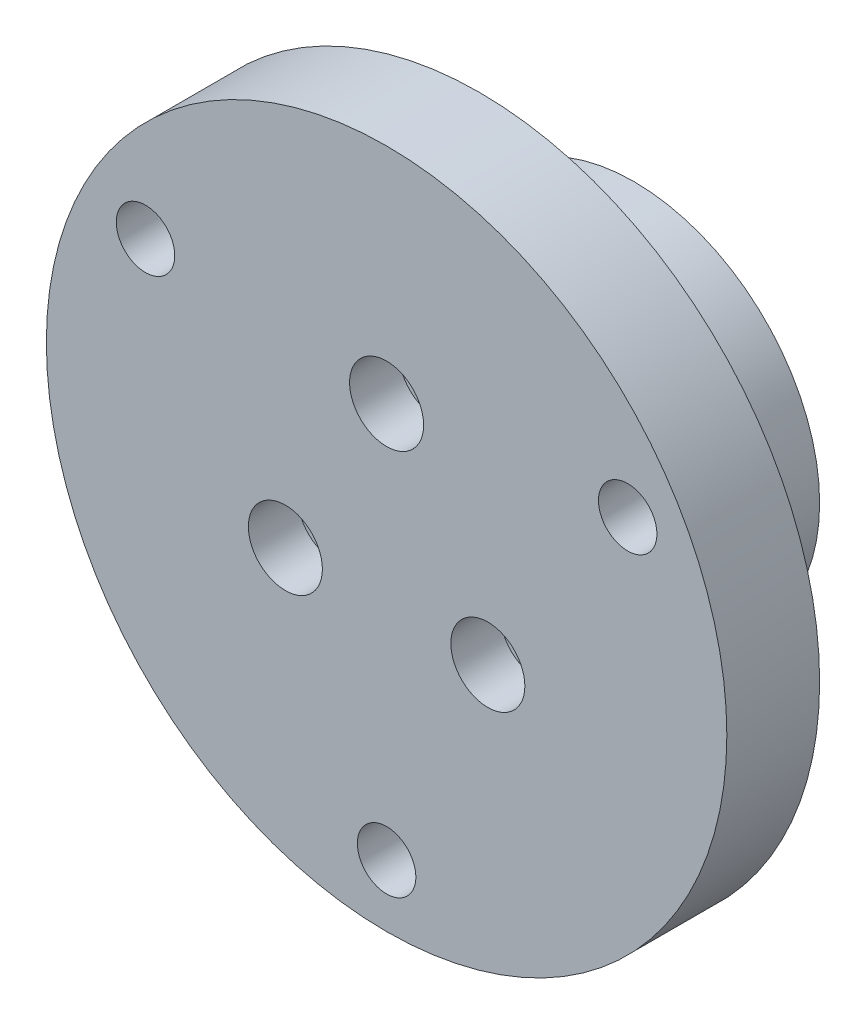
ISO-10303-21;
HEADER;
FILE_DESCRIPTION(('STEP AP214'),'2;1');
FILE_NAME('part.step','',(''),(''),'','','');
FILE_SCHEMA(('AUTOMOTIVE_DESIGN { 1 0 10303 214 1 1 1 1 }'));
ENDSEC;
DATA;
#1=APPLICATION_CONTEXT('core data for automotive mechanical design processes');
#2=APPLICATION_PROTOCOL_DEFINITION('international standard','automotive_design',2000,#1);
#3=PRODUCT_CONTEXT('',#1,'mechanical');
#4=PRODUCT('Part','Part','',(#3));
#5=PRODUCT_RELATED_PRODUCT_CATEGORY('part','',(#4));
#6=PRODUCT_DEFINITION_FORMATION('','',#4);
#7=PRODUCT_DEFINITION_CONTEXT('part definition',#1,'design');
#8=PRODUCT_DEFINITION('design','',#6,#7);
#9=PRODUCT_DEFINITION_SHAPE('','',#8);
#10=(LENGTH_UNIT() NAMED_UNIT(*) SI_UNIT(.MILLI.,.METRE.));
#11=(NAMED_UNIT(*) PLANE_ANGLE_UNIT() SI_UNIT($,.RADIAN.));
#12=(NAMED_UNIT(*) SI_UNIT($,.STERADIAN.) SOLID_ANGLE_UNIT());
#13=UNCERTAINTY_MEASURE_WITH_UNIT(LENGTH_MEASURE(1.E-05),#10,'distance_accuracy_value','');
#14=(GEOMETRIC_REPRESENTATION_CONTEXT(3) GLOBAL_UNCERTAINTY_ASSIGNED_CONTEXT((#13)) GLOBAL_UNIT_ASSIGNED_CONTEXT((#10,
#11,#12)) REPRESENTATION_CONTEXT('',''));
#15=CARTESIAN_POINT('',(0.,0.,0.));
#16=DIRECTION('',(0.,0.,1.));
#17=DIRECTION('',(1.,0.,0.));
#18=AXIS2_PLACEMENT_3D('',#15,#16,#17);
#19=CARTESIAN_POINT('',(-5.1961530289244,-3.00000035000002,0.));
#20=DIRECTION('',(0.,0.,-1.));
#21=DIRECTION('',(-1.,0.,0.));
#22=AXIS2_PLACEMENT_3D('',#19,#20,#21);
#23=CYLINDRICAL_SURFACE('',#22,1.19999999999999);
#24=CARTESIAN_POINT('',(-5.1961530289244,-3.00000035000002,0.));
#25=DIRECTION('',(0.,0.,-1.));
#26=DIRECTION('',(-1.,0.,0.));
#27=AXIS2_PLACEMENT_3D('',#24,#25,#26);
#28=CIRCLE('',#27,1.19999999999999);
#29=CARTESIAN_POINT('',(-6.39615302892439,-3.00000035000002,0.));
#30=VERTEX_POINT('',#29);
#31=EDGE_CURVE('E95',#30,#30,#28,.T.);
#32=ORIENTED_EDGE('',*,*,#31,.T.);
#33=EDGE_LOOP('',(#32));
#34=FACE_BOUND('',#33,.T.);
#35=CARTESIAN_POINT('',(-5.1961530289244,-3.00000035000002,10.16));
#36=DIRECTION('',(0.,0.,1.));
#37=DIRECTION('',(1.,0.,0.));
#38=AXIS2_PLACEMENT_3D('',#35,#36,#37);
#39=CIRCLE('',#38,1.19999999999999);
#40=CARTESIAN_POINT('',(-3.99615302892441,-3.00000035000002,10.16));
#41=VERTEX_POINT('',#40);
#42=EDGE_CURVE('E58',#41,#41,#39,.F.);
#43=ORIENTED_EDGE('',*,*,#42,.F.);
#44=EDGE_LOOP('',(#43));
#45=FACE_BOUND('',#44,.T.);
#46=ADVANCED_FACE('F32',(#34,#45),#23,.F.);
#47=CARTESIAN_POINT('',(5.19615302892444,-3.00000034999995,0.));
#48=DIRECTION('',(0.,0.,-1.));
#49=DIRECTION('',(-1.,0.,0.));
#50=AXIS2_PLACEMENT_3D('',#47,#48,#49);
#51=CYLINDRICAL_SURFACE('',#50,1.19999999999999);
#52=CARTESIAN_POINT('',(5.19615302892444,-3.00000034999995,0.));
#53=DIRECTION('',(0.,0.,-1.));
#54=DIRECTION('',(-1.,0.,0.));
#55=AXIS2_PLACEMENT_3D('',#52,#53,#54);
#56=CIRCLE('',#55,1.19999999999999);
#57=CARTESIAN_POINT('',(3.99615302892445,-3.00000034999995,0.));
#58=VERTEX_POINT('',#57);
#59=EDGE_CURVE('E61',#58,#58,#56,.T.);
#60=ORIENTED_EDGE('',*,*,#59,.T.);
#61=EDGE_LOOP('',(#60));
#62=FACE_BOUND('',#61,.T.);
#63=CARTESIAN_POINT('',(5.19615302892444,-3.00000034999995,10.16));
#64=DIRECTION('',(0.,0.,1.));
#65=DIRECTION('',(1.,0.,0.));
#66=AXIS2_PLACEMENT_3D('',#63,#64,#65);
#67=CIRCLE('',#66,1.19999999999999);
#68=CARTESIAN_POINT('',(6.39615302892443,-3.00000034999995,10.16));
#69=VERTEX_POINT('',#68);
#70=EDGE_CURVE('E62',#69,#69,#67,.F.);
#71=ORIENTED_EDGE('',*,*,#70,.F.);
#72=EDGE_LOOP('',(#71));
#73=FACE_BOUND('',#72,.T.);
#74=ADVANCED_FACE('F147',(#62,#73),#51,.F.);
#75=CARTESIAN_POINT('',(0.,0.,12.7));
#76=DIRECTION('',(0.,0.,1.));
#77=DIRECTION('',(1.,0.,0.));
#78=AXIS2_PLACEMENT_3D('',#75,#76,#77);
#79=PLANE('',#78);
#80=CARTESIAN_POINT('',(0.,-14.2875,12.7));
#81=DIRECTION('',(0.,0.,-1.));
#82=DIRECTION('',(0.500000000000004,-0.866025403784436,0.));
#83=AXIS2_PLACEMENT_3D('',#80,#81,#82);
#84=CIRCLE('',#83,1.499997);
#85=CARTESIAN_POINT('',(0.7499985,-15.5865355076004,12.7));
#86=VERTEX_POINT('',#85);
#87=EDGE_CURVE('E57',#86,#86,#84,.T.);
#88=ORIENTED_EDGE('',*,*,#87,.T.);
#89=EDGE_LOOP('',(#88));
#90=FACE_BOUND('',#89,.T.);
#91=CARTESIAN_POINT('',(12.3733379565701,7.14375000000005,12.7));
#92=DIRECTION('',(0.,0.,-1.));
#93=DIRECTION('',(0.499999999999992,0.866025403784443,0.));
#94=AXIS2_PLACEMENT_3D('',#91,#92,#93);
#95=CIRCLE('',#94,1.499997);
#96=CARTESIAN_POINT('',(13.1233364565701,8.44278550760051,12.7));
#97=VERTEX_POINT('',#96);
#98=EDGE_CURVE('E110',#97,#97,#95,.T.);
#99=ORIENTED_EDGE('',*,*,#98,.T.);
#100=EDGE_LOOP('',(#99));
#101=FACE_BOUND('',#100,.T.);
#102=CARTESIAN_POINT('',(-5.1961530289244,-3.00000035000002,12.7));
#103=DIRECTION('',(0.,0.,1.));
#104=DIRECTION('',(-0.500000000000004,0.866025403784436,0.));
#105=AXIS2_PLACEMENT_3D('',#102,#103,#104);
#106=CIRCLE('',#105,1.9);
#107=CARTESIAN_POINT('',(-6.14615302892441,-1.3545520828096,12.7));
#108=VERTEX_POINT('',#107);
#109=EDGE_CURVE('E105',#108,#108,#106,.T.);
#110=ORIENTED_EDGE('',*,*,#109,.F.);
#111=EDGE_LOOP('',(#110));
#112=FACE_BOUND('',#111,.T.);
#113=CARTESIAN_POINT('',(5.19615302892444,-3.00000034999995,12.7));
#114=DIRECTION('',(0.,0.,1.));
#115=DIRECTION('',(-0.499999999999992,-0.866025403784443,0.));
#116=AXIS2_PLACEMENT_3D('',#113,#114,#115);
#117=CIRCLE('',#116,1.9);
#118=CARTESIAN_POINT('',(4.24615302892446,-4.64544861719039,12.7));
#119=VERTEX_POINT('',#118);
#120=EDGE_CURVE('E53',#119,#119,#117,.T.);
#121=ORIENTED_EDGE('',*,*,#120,.F.);
#122=EDGE_LOOP('',(#121));
#123=FACE_BOUND('',#122,.T.);
#124=CARTESIAN_POINT('',(0.,0.,12.7));
#125=DIRECTION('',(0.,0.,1.));
#126=DIRECTION('',(1.,0.,0.));
#127=AXIS2_PLACEMENT_3D('',#124,#125,#126);
#128=CIRCLE('',#127,17.4625);
#129=CARTESIAN_POINT('',(17.4625,0.,12.7));
#130=VERTEX_POINT('',#129);
#131=EDGE_CURVE('E71',#130,#130,#128,.T.);
#132=ORIENTED_EDGE('',*,*,#131,.T.);
#133=EDGE_LOOP('',(#132));
#134=FACE_BOUND('',#133,.T.);
#135=CARTESIAN_POINT('',(0.,6.0000007,12.7));
#136=DIRECTION('',(0.,0.,1.));
#137=DIRECTION('',(1.,0.,0.));
#138=AXIS2_PLACEMENT_3D('',#135,#136,#137);
#139=CIRCLE('',#138,1.9);
#140=CARTESIAN_POINT('',(1.9,6.0000007,12.7));
#141=VERTEX_POINT('',#140);
#142=EDGE_CURVE('E84',#141,#141,#139,.T.);
#143=ORIENTED_EDGE('',*,*,#142,.F.);
#144=EDGE_LOOP('',(#143));
#145=FACE_BOUND('',#144,.T.);
#146=CARTESIAN_POINT('',(-12.3733379565701,7.14375000000006,12.7));
#147=DIRECTION('',(0.,0.,-1.));
#148=DIRECTION('',(-1.,0.,0.));
#149=AXIS2_PLACEMENT_3D('',#146,#147,#148);
#150=CIRCLE('',#149,1.499997);
#151=CARTESIAN_POINT('',(-13.8733349565701,7.14375000000006,12.7));
#152=VERTEX_POINT('',#151);
#153=EDGE_CURVE('E92',#152,#152,#150,.T.);
#154=ORIENTED_EDGE('',*,*,#153,.T.);
#155=EDGE_LOOP('',(#154));
#156=FACE_BOUND('',#155,.T.);
#157=ADVANCED_FACE('F116',(#90,#101,#112,#123,#134,#145,#156),#79,.T.);
#158=CARTESIAN_POINT('',(0.,6.0000007,0.));
#159=DIRECTION('',(0.,0.,-1.));
#160=DIRECTION('',(-1.,0.,0.));
#161=AXIS2_PLACEMENT_3D('',#158,#159,#160);
#162=CYLINDRICAL_SURFACE('',#161,1.19999999999999);
#163=CARTESIAN_POINT('',(0.,6.0000007,0.));
#164=DIRECTION('',(0.,0.,-1.));
#165=DIRECTION('',(-1.,0.,0.));
#166=AXIS2_PLACEMENT_3D('',#163,#164,#165);
#167=CIRCLE('',#166,1.19999999999999);
#168=CARTESIAN_POINT('',(-1.19999999999999,6.0000007,0.));
#169=VERTEX_POINT('',#168);
#170=EDGE_CURVE('E68',#169,#169,#167,.T.);
#171=ORIENTED_EDGE('',*,*,#170,.T.);
#172=EDGE_LOOP('',(#171));
#173=FACE_BOUND('',#172,.T.);
#174=CARTESIAN_POINT('',(0.,6.0000007,10.16));
#175=DIRECTION('',(0.,0.,1.));
#176=DIRECTION('',(1.,0.,0.));
#177=AXIS2_PLACEMENT_3D('',#174,#175,#176);
#178=CIRCLE('',#177,1.19999999999999);
#179=CARTESIAN_POINT('',(1.19999999999999,6.0000007,10.16));
#180=VERTEX_POINT('',#179);
#181=EDGE_CURVE('E66',#180,#180,#178,.F.);
#182=ORIENTED_EDGE('',*,*,#181,.F.);
#183=EDGE_LOOP('',(#182));
#184=FACE_BOUND('',#183,.T.);
#185=ADVANCED_FACE('F146',(#173,#184),#162,.F.);
#186=CARTESIAN_POINT('',(0.,0.,12.7));
#187=DIRECTION('',(0.,0.,-1.));
#188=DIRECTION('',(-1.,0.,0.));
#189=AXIS2_PLACEMENT_3D('',#186,#187,#188);
#190=CYLINDRICAL_SURFACE('',#189,9.525);
#191=CARTESIAN_POINT('',(0.,0.,6.35));
#192=DIRECTION('',(0.,0.,1.));
#193=DIRECTION('',(1.,0.,0.));
#194=AXIS2_PLACEMENT_3D('',#191,#192,#193);
#195=CIRCLE('',#194,9.525);
#196=CARTESIAN_POINT('',(9.525,0.,6.35));
#197=VERTEX_POINT('',#196);
#198=EDGE_CURVE('E10',#197,#197,#195,.F.);
#199=ORIENTED_EDGE('',*,*,#198,.T.);
#200=EDGE_LOOP('',(#199));
#201=FACE_BOUND('',#200,.T.);
#202=CARTESIAN_POINT('',(0.,0.,0.));
#203=DIRECTION('',(0.,0.,1.));
#204=DIRECTION('',(1.,0.,0.));
#205=AXIS2_PLACEMENT_3D('',#202,#203,#204);
#206=CIRCLE('',#205,9.525);
#207=CARTESIAN_POINT('',(9.525,0.,0.));
#208=VERTEX_POINT('',#207);
#209=EDGE_CURVE('E43',#208,#208,#206,.T.);
#210=ORIENTED_EDGE('',*,*,#209,.T.);
#211=EDGE_LOOP('',(#210));
#212=FACE_BOUND('',#211,.T.);
#213=ADVANCED_FACE('F230',(#201,#212),#190,.T.);
#214=CARTESIAN_POINT('',(0.,0.,0.));
#215=DIRECTION('',(0.,0.,1.));
#216=DIRECTION('',(1.,0.,0.));
#217=AXIS2_PLACEMENT_3D('',#214,#215,#216);
#218=PLANE('',#217);
#219=ORIENTED_EDGE('',*,*,#59,.F.);
#220=EDGE_LOOP('',(#219));
#221=FACE_BOUND('',#220,.T.);
#222=ORIENTED_EDGE('',*,*,#31,.F.);
#223=EDGE_LOOP('',(#222));
#224=FACE_BOUND('',#223,.T.);
#225=ORIENTED_EDGE('',*,*,#170,.F.);
#226=EDGE_LOOP('',(#225));
#227=FACE_BOUND('',#226,.T.);
#228=CARTESIAN_POINT('',(0.,0.,0.));
#229=DIRECTION('',(0.,0.,-1.));
#230=DIRECTION('',(-1.,0.,0.));
#231=AXIS2_PLACEMENT_3D('',#228,#229,#230);
#232=CIRCLE('',#231,4.572);
#233=CARTESIAN_POINT('',(-4.572,0.,0.));
#234=VERTEX_POINT('',#233);
#235=EDGE_CURVE('E77',#234,#234,#232,.T.);
#236=ORIENTED_EDGE('',*,*,#235,.F.);
#237=EDGE_LOOP('',(#236));
#238=FACE_BOUND('',#237,.T.);
#239=ORIENTED_EDGE('',*,*,#209,.F.);
#240=EDGE_LOOP('',(#239));
#241=FACE_BOUND('',#240,.T.);
#242=ADVANCED_FACE('F140',(#221,#224,#227,#238,#241),#218,.F.);
#243=CARTESIAN_POINT('',(0.,0.,7.9375));
#244=DIRECTION('',(0.,0.,1.));
#245=DIRECTION('',(1.,0.,0.));
#246=AXIS2_PLACEMENT_3D('',#243,#244,#245);
#247=CYLINDRICAL_SURFACE('',#246,17.4625);
#248=CARTESIAN_POINT('',(0.,0.,7.9375));
#249=DIRECTION('',(0.,0.,1.));
#250=DIRECTION('',(1.,0.,0.));
#251=AXIS2_PLACEMENT_3D('',#248,#249,#250);
#252=CIRCLE('',#251,17.4625);
#253=CARTESIAN_POINT('',(17.4625,0.,7.9375));
#254=VERTEX_POINT('',#253);
#255=EDGE_CURVE('E47',#254,#254,#252,.T.);
#256=CARTESIAN_POINT('',(17.4625,0.,7.9375));
#257=CARTESIAN_POINT('',(17.4625,0.,7.987109375));
#258=CARTESIAN_POINT('',(17.4625,0.,8.03671875));
#259=CARTESIAN_POINT('',(17.4625,0.,8.1359375));
#260=CARTESIAN_POINT('',(17.4625,0.,8.185546875));
#261=CARTESIAN_POINT('',(17.4625,0.,8.284765625));
#262=CARTESIAN_POINT('',(17.4625,0.,8.334375));
#263=CARTESIAN_POINT('',(17.4625,0.,8.43359375));
#264=CARTESIAN_POINT('',(17.4625,0.,8.483203125));
#265=CARTESIAN_POINT('',(17.4625,0.,8.582421875));
#266=CARTESIAN_POINT('',(17.4625,0.,8.63203125));
#267=CARTESIAN_POINT('',(17.4625,0.,8.73125));
#268=CARTESIAN_POINT('',(17.4625,0.,8.780859375));
#269=CARTESIAN_POINT('',(17.4625,0.,8.880078125));
#270=CARTESIAN_POINT('',(17.4625,0.,8.9296875));
#271=CARTESIAN_POINT('',(17.4625,0.,9.02890625));
#272=CARTESIAN_POINT('',(17.4625,0.,9.078515625));
#273=CARTESIAN_POINT('',(17.4625,0.,9.177734375));
#274=CARTESIAN_POINT('',(17.4625,0.,9.22734375));
#275=CARTESIAN_POINT('',(17.4625,0.,9.3265625));
#276=CARTESIAN_POINT('',(17.4625,0.,9.376171875));
#277=CARTESIAN_POINT('',(17.4625,0.,9.475390625));
#278=CARTESIAN_POINT('',(17.4625,0.,9.525));
#279=CARTESIAN_POINT('',(17.4625,0.,9.62421875));
#280=CARTESIAN_POINT('',(17.4625,0.,9.673828125));
#281=CARTESIAN_POINT('',(17.4625,0.,9.773046875));
#282=CARTESIAN_POINT('',(17.4625,0.,9.82265625));
#283=CARTESIAN_POINT('',(17.4625,0.,9.921875));
#284=CARTESIAN_POINT('',(17.4625,0.,9.971484375));
#285=CARTESIAN_POINT('',(17.4625,0.,10.070703125));
#286=CARTESIAN_POINT('',(17.4625,0.,10.1203125));
#287=CARTESIAN_POINT('',(17.4625,0.,10.21953125));
#288=CARTESIAN_POINT('',(17.4625,0.,10.269140625));
#289=CARTESIAN_POINT('',(17.4625,0.,10.368359375));
#290=CARTESIAN_POINT('',(17.4625,0.,10.41796875));
#291=CARTESIAN_POINT('',(17.4625,0.,10.5171875));
#292=CARTESIAN_POINT('',(17.4625,0.,10.566796875));
#293=CARTESIAN_POINT('',(17.4625,0.,10.666015625));
#294=CARTESIAN_POINT('',(17.4625,0.,10.715625));
#295=CARTESIAN_POINT('',(17.4625,0.,10.81484375));
#296=CARTESIAN_POINT('',(17.4625,0.,10.864453125));
#297=CARTESIAN_POINT('',(17.4625,0.,10.963671875));
#298=CARTESIAN_POINT('',(17.4625,0.,11.01328125));
#299=CARTESIAN_POINT('',(17.4625,0.,11.1125));
#300=CARTESIAN_POINT('',(17.4625,0.,11.162109375));
#301=CARTESIAN_POINT('',(17.4625,0.,11.261328125));
#302=CARTESIAN_POINT('',(17.4625,0.,11.3109375));
#303=CARTESIAN_POINT('',(17.4625,0.,11.41015625));
#304=CARTESIAN_POINT('',(17.4625,0.,11.459765625));
#305=CARTESIAN_POINT('',(17.4625,0.,11.558984375));
#306=CARTESIAN_POINT('',(17.4625,0.,11.60859375));
#307=CARTESIAN_POINT('',(17.4625,0.,11.7078125));
#308=CARTESIAN_POINT('',(17.4625,0.,11.757421875));
#309=CARTESIAN_POINT('',(17.4625,0.,11.856640625));
#310=CARTESIAN_POINT('',(17.4625,0.,11.90625));
#311=CARTESIAN_POINT('',(17.4625,0.,12.00546875));
#312=CARTESIAN_POINT('',(17.4625,0.,12.055078125));
#313=CARTESIAN_POINT('',(17.4625,0.,12.154296875));
#314=CARTESIAN_POINT('',(17.4625,0.,12.20390625));
#315=CARTESIAN_POINT('',(17.4625,0.,12.303125));
#316=CARTESIAN_POINT('',(17.4625,0.,12.352734375));
#317=CARTESIAN_POINT('',(17.4625,0.,12.451953125));
#318=CARTESIAN_POINT('',(17.4625,0.,12.5015625));
#319=CARTESIAN_POINT('',(17.4625,0.,12.60078125));
#320=CARTESIAN_POINT('',(17.4625,0.,12.650390625));
#321=CARTESIAN_POINT('',(17.4625,0.,12.7));
#322=B_SPLINE_CURVE_WITH_KNOTS('',3,(#256,#257,#258,#259,#260,#261,#262,#263,#264,#265,#266,
#267,#268,#269,#270,#271,#272,#273,#274,#275,#276,#277,#278,#279,#280,#281,#282,#283,#284,#285,
#286,#287,#288,#289,#290,#291,#292,#293,#294,#295,#296,#297,#298,#299,#300,#301,#302,#303,#304,
#305,#306,#307,#308,#309,#310,#311,#312,#313,#314,#315,#316,#317,#318,#319,#320,#321),
.UNSPECIFIED.,.F.,.F.,(4,2,2,2,2,2,2,2,2,2,2,2,2,2,2,2,2,2,2,2,2,2,2,2,2,2,2,2,2,2,2,2,4),(0.,
0.148828124999998,0.297656249999998,0.446484374999999,0.595312499999999,0.744140624999999,
0.892968749999999,1.041796875,1.190625,1.339453125,1.48828125,1.637109375,1.7859375,1.934765625,
2.08359375,2.232421875,2.38125,2.530078125,2.67890625,2.827734375,2.9765625,3.125390625,
3.27421875,3.423046875,3.571875,3.720703125,3.86953125,4.018359375,4.1671875,4.316015625,
4.46484375,4.613671875,4.7625),.UNSPECIFIED.);
#323=EDGE_CURVE('BSEAM130',#254,#130,#322,.T.);
#324=ORIENTED_EDGE('',*,*,#255,.T.);
#325=ORIENTED_EDGE('',*,*,#131,.F.);
#326=ORIENTED_EDGE('',*,*,#323,.T.);
#327=ORIENTED_EDGE('',*,*,#323,.F.);
#328=EDGE_LOOP('',(#324,#326,#325,#327));
#329=FACE_BOUND('',#328,.T.);
#330=ADVANCED_FACE('F130',(#329),#247,.T.);
#331=CARTESIAN_POINT('',(0.,0.,7.9375));
#332=DIRECTION('',(0.,0.,1.));
#333=DIRECTION('',(1.,0.,0.));
#334=AXIS2_PLACEMENT_3D('',#331,#332,#333);
#335=PLANE('',#334);
#336=CARTESIAN_POINT('',(0.,0.,7.9375));
#337=DIRECTION('',(0.,0.,1.));
#338=DIRECTION('',(1.,0.,0.));
#339=AXIS2_PLACEMENT_3D('',#336,#337,#338);
#340=CIRCLE('',#339,11.1125);
#341=CARTESIAN_POINT('',(11.1125,0.,7.9375));
#342=VERTEX_POINT('',#341);
#343=EDGE_CURVE('E39',#342,#342,#340,.T.);
#344=ORIENTED_EDGE('',*,*,#343,.T.);
#345=EDGE_LOOP('',(#344));
#346=FACE_BOUND('',#345,.T.);
#347=CARTESIAN_POINT('',(0.,-14.2875,7.9375));
#348=DIRECTION('',(0.,0.,1.));
#349=DIRECTION('',(1.,0.,0.));
#350=AXIS2_PLACEMENT_3D('',#347,#348,#349);
#351=CIRCLE('',#350,1.499997);
#352=CARTESIAN_POINT('',(1.49999699999999,-14.2875,7.9375));
#353=VERTEX_POINT('',#352);
#354=EDGE_CURVE('E50',#353,#353,#351,.T.);
#355=ORIENTED_EDGE('',*,*,#354,.T.);
#356=EDGE_LOOP('',(#355));
#357=FACE_BOUND('',#356,.T.);
#358=CARTESIAN_POINT('',(12.3733379565701,7.14375000000005,7.9375));
#359=DIRECTION('',(0.,0.,1.));
#360=DIRECTION('',(1.,0.,0.));
#361=AXIS2_PLACEMENT_3D('',#358,#359,#360);
#362=CIRCLE('',#361,1.499997);
#363=CARTESIAN_POINT('',(13.8733349565701,7.14375000000005,7.9375));
#364=VERTEX_POINT('',#363);
#365=EDGE_CURVE('E54',#364,#364,#362,.T.);
#366=ORIENTED_EDGE('',*,*,#365,.T.);
#367=EDGE_LOOP('',(#366));
#368=FACE_BOUND('',#367,.T.);
#369=CARTESIAN_POINT('',(-12.3733379565701,7.14375000000006,7.9375));
#370=DIRECTION('',(0.,0.,1.));
#371=DIRECTION('',(1.,0.,0.));
#372=AXIS2_PLACEMENT_3D('',#369,#370,#371);
#373=CIRCLE('',#372,1.499997);
#374=CARTESIAN_POINT('',(-10.8733409565701,7.14375000000006,7.9375));
#375=VERTEX_POINT('',#374);
#376=EDGE_CURVE('E87',#375,#375,#373,.T.);
#377=ORIENTED_EDGE('',*,*,#376,.T.);
#378=EDGE_LOOP('',(#377));
#379=FACE_BOUND('',#378,.T.);
#380=ORIENTED_EDGE('',*,*,#255,.F.);
#381=EDGE_LOOP('',(#380));
#382=FACE_BOUND('',#381,.T.);
#383=ADVANCED_FACE('F126',(#346,#357,#368,#379,#382),#335,.F.);
#384=CARTESIAN_POINT('',(0.,0.,2.9972));
#385=DIRECTION('',(0.,0.,-1.));
#386=DIRECTION('',(-1.,0.,0.));
#387=AXIS2_PLACEMENT_3D('',#384,#385,#386);
#388=CYLINDRICAL_SURFACE('',#387,4.572);
#389=CARTESIAN_POINT('',(0.,0.,2.9972));
#390=DIRECTION('',(0.,0.,-1.));
#391=DIRECTION('',(-1.,0.,0.));
#392=AXIS2_PLACEMENT_3D('',#389,#390,#391);
#393=CIRCLE('',#392,4.572);
#394=CARTESIAN_POINT('',(-4.572,0.,2.9972));
#395=VERTEX_POINT('',#394);
#396=EDGE_CURVE('E74',#395,#395,#393,.T.);
#397=CARTESIAN_POINT('',(-4.572,0.,2.9972));
#398=CARTESIAN_POINT('',(-4.572,0.,2.96597916666667));
#399=CARTESIAN_POINT('',(-4.572,0.,2.93475833333333));
#400=CARTESIAN_POINT('',(-4.572,0.,2.87231666666667));
#401=CARTESIAN_POINT('',(-4.572,0.,2.84109583333333));
#402=CARTESIAN_POINT('',(-4.572,0.,2.77865416666667));
#403=CARTESIAN_POINT('',(-4.572,0.,2.74743333333333));
#404=CARTESIAN_POINT('',(-4.572,0.,2.68499166666667));
#405=CARTESIAN_POINT('',(-4.572,0.,2.65377083333333));
#406=CARTESIAN_POINT('',(-4.572,0.,2.59132916666667));
#407=CARTESIAN_POINT('',(-4.572,0.,2.56010833333333));
#408=CARTESIAN_POINT('',(-4.572,0.,2.49766666666667));
#409=CARTESIAN_POINT('',(-4.572,0.,2.46644583333333));
#410=CARTESIAN_POINT('',(-4.572,0.,2.40400416666667));
#411=CARTESIAN_POINT('',(-4.572,0.,2.37278333333333));
#412=CARTESIAN_POINT('',(-4.572,0.,2.31034166666667));
#413=CARTESIAN_POINT('',(-4.572,0.,2.27912083333333));
#414=CARTESIAN_POINT('',(-4.572,0.,2.21667916666667));
#415=CARTESIAN_POINT('',(-4.572,0.,2.18545833333333));
#416=CARTESIAN_POINT('',(-4.572,0.,2.12301666666667));
#417=CARTESIAN_POINT('',(-4.572,0.,2.09179583333333));
#418=CARTESIAN_POINT('',(-4.572,0.,2.02935416666667));
#419=CARTESIAN_POINT('',(-4.572,0.,1.99813333333333));
#420=CARTESIAN_POINT('',(-4.572,0.,1.93569166666667));
#421=CARTESIAN_POINT('',(-4.572,0.,1.90447083333333));
#422=CARTESIAN_POINT('',(-4.572,0.,1.84202916666667));
#423=CARTESIAN_POINT('',(-4.572,0.,1.81080833333333));
#424=CARTESIAN_POINT('',(-4.572,0.,1.74836666666667));
#425=CARTESIAN_POINT('',(-4.572,0.,1.71714583333333));
#426=CARTESIAN_POINT('',(-4.572,0.,1.65470416666667));
#427=CARTESIAN_POINT('',(-4.572,0.,1.62348333333333));
#428=CARTESIAN_POINT('',(-4.572,0.,1.56104166666667));
#429=CARTESIAN_POINT('',(-4.572,0.,1.52982083333333));
#430=CARTESIAN_POINT('',(-4.572,0.,1.46737916666667));
#431=CARTESIAN_POINT('',(-4.572,0.,1.43615833333333));
#432=CARTESIAN_POINT('',(-4.572,0.,1.37371666666667));
#433=CARTESIAN_POINT('',(-4.572,0.,1.34249583333333));
#434=CARTESIAN_POINT('',(-4.572,0.,1.28005416666667));
#435=CARTESIAN_POINT('',(-4.572,0.,1.24883333333333));
#436=CARTESIAN_POINT('',(-4.572,0.,1.18639166666667));
#437=CARTESIAN_POINT('',(-4.572,0.,1.15517083333333));
#438=CARTESIAN_POINT('',(-4.572,0.,1.09272916666667));
#439=CARTESIAN_POINT('',(-4.572,0.,1.06150833333333));
#440=CARTESIAN_POINT('',(-4.572,0.,0.999066666666667));
#441=CARTESIAN_POINT('',(-4.572,0.,0.967845833333333));
#442=CARTESIAN_POINT('',(-4.572,0.,0.905404166666667));
#443=CARTESIAN_POINT('',(-4.572,0.,0.874183333333333));
#444=CARTESIAN_POINT('',(-4.572,0.,0.811741666666667));
#445=CARTESIAN_POINT('',(-4.572,0.,0.780520833333333));
#446=CARTESIAN_POINT('',(-4.572,0.,0.718079166666667));
#447=CARTESIAN_POINT('',(-4.572,0.,0.686858333333333));
#448=CARTESIAN_POINT('',(-4.572,0.,0.624416666666667));
#449=CARTESIAN_POINT('',(-4.572,0.,0.593195833333333));
#450=CARTESIAN_POINT('',(-4.572,0.,0.530754166666667));
#451=CARTESIAN_POINT('',(-4.572,0.,0.499533333333333));
#452=CARTESIAN_POINT('',(-4.572,0.,0.437091666666667));
#453=CARTESIAN_POINT('',(-4.572,0.,0.405870833333333));
#454=CARTESIAN_POINT('',(-4.572,0.,0.343429166666667));
#455=CARTESIAN_POINT('',(-4.572,0.,0.312208333333333));
#456=CARTESIAN_POINT('',(-4.572,0.,0.249766666666667));
#457=CARTESIAN_POINT('',(-4.572,0.,0.218545833333333));
#458=CARTESIAN_POINT('',(-4.572,0.,0.156104166666667));
#459=CARTESIAN_POINT('',(-4.572,0.,0.124883333333333));
#460=CARTESIAN_POINT('',(-4.572,0.,0.0624416666666668));
#461=CARTESIAN_POINT('',(-4.572,0.,0.0312208333333333));
#462=CARTESIAN_POINT('',(-4.572,0.,0.));
#463=B_SPLINE_CURVE_WITH_KNOTS('',3,(#397,#398,#399,#400,#401,#402,#403,#404,#405,#406,#407,
#408,#409,#410,#411,#412,#413,#414,#415,#416,#417,#418,#419,#420,#421,#422,#423,#424,#425,#426,
#427,#428,#429,#430,#431,#432,#433,#434,#435,#436,#437,#438,#439,#440,#441,#442,#443,#444,#445,
#446,#447,#448,#449,#450,#451,#452,#453,#454,#455,#456,#457,#458,#459,#460,#461,#462),
.UNSPECIFIED.,.F.,.F.,(4,2,2,2,2,2,2,2,2,2,2,2,2,2,2,2,2,2,2,2,2,2,2,2,2,2,2,2,2,2,2,2,4),(0.,
0.0936624999999997,0.187325,0.2809875,0.37465,0.4683125,0.561975,0.6556375,0.7493,0.8429625,
0.936624999999999,1.0302875,1.12395,1.2176125,1.311275,1.4049375,1.4986,1.5922625,1.685925,
1.7795875,1.87325,1.9669125,2.060575,2.1542375,2.2479,2.3415625,2.435225,2.5288875,2.62255,
2.7162125,2.809875,2.9035375,2.9972),.UNSPECIFIED.);
#464=EDGE_CURVE('BSEAM129',#395,#234,#463,.T.);
#465=ORIENTED_EDGE('',*,*,#396,.F.);
#466=ORIENTED_EDGE('',*,*,#235,.T.);
#467=ORIENTED_EDGE('',*,*,#464,.T.);
#468=ORIENTED_EDGE('',*,*,#464,.F.);
#469=EDGE_LOOP('',(#465,#467,#466,#468));
#470=FACE_BOUND('',#469,.T.);
#471=ADVANCED_FACE('F129',(#470),#388,.F.);
#472=CARTESIAN_POINT('',(0.,0.,2.9972));
#473=DIRECTION('',(0.,0.,-1.));
#474=DIRECTION('',(-1.,0.,0.));
#475=AXIS2_PLACEMENT_3D('',#472,#473,#474);
#476=PLANE('',#475);
#477=ORIENTED_EDGE('',*,*,#396,.T.);
#478=EDGE_LOOP('',(#477));
#479=FACE_BOUND('',#478,.T.);
#480=ADVANCED_FACE('F257',(#479),#476,.T.);
#481=CARTESIAN_POINT('',(0.,6.0000007,10.16));
#482=DIRECTION('',(0.,0.,1.));
#483=DIRECTION('',(1.,0.,0.));
#484=AXIS2_PLACEMENT_3D('',#481,#482,#483);
#485=PLANE('',#484);
#486=CARTESIAN_POINT('',(0.,6.0000007,10.16));
#487=DIRECTION('',(0.,0.,1.));
#488=DIRECTION('',(1.,0.,0.));
#489=AXIS2_PLACEMENT_3D('',#486,#487,#488);
#490=CIRCLE('',#489,1.9);
#491=CARTESIAN_POINT('',(1.9,6.0000007,10.16));
#492=VERTEX_POINT('',#491);
#493=EDGE_CURVE('E69',#492,#492,#490,.T.);
#494=ORIENTED_EDGE('',*,*,#493,.T.);
#495=EDGE_LOOP('',(#494));
#496=FACE_BOUND('',#495,.T.);
#497=ORIENTED_EDGE('',*,*,#181,.T.);
#498=EDGE_LOOP('',(#497));
#499=FACE_BOUND('',#498,.T.);
#500=ADVANCED_FACE('F166',(#496,#499),#485,.T.);
#501=CARTESIAN_POINT('',(0.,6.0000007,10.16));
#502=DIRECTION('',(0.,0.,1.));
#503=DIRECTION('',(1.,0.,0.));
#504=AXIS2_PLACEMENT_3D('',#501,#502,#503);
#505=CYLINDRICAL_SURFACE('',#504,1.9);
#506=ORIENTED_EDGE('',*,*,#493,.F.);
#507=EDGE_LOOP('',(#506));
#508=FACE_BOUND('',#507,.T.);
#509=ORIENTED_EDGE('',*,*,#142,.T.);
#510=EDGE_LOOP('',(#509));
#511=FACE_BOUND('',#510,.T.);
#512=ADVANCED_FACE('F157',(#508,#511),#505,.F.);
#513=CARTESIAN_POINT('',(-12.3733379565701,7.14375000000006,12.7));
#514=DIRECTION('',(0.,0.,-1.));
#515=DIRECTION('',(-1.,0.,0.));
#516=AXIS2_PLACEMENT_3D('',#513,#514,#515);
#517=CYLINDRICAL_SURFACE('',#516,1.499997);
#518=ORIENTED_EDGE('',*,*,#153,.F.);
#519=EDGE_LOOP('',(#518));
#520=FACE_BOUND('',#519,.T.);
#521=ORIENTED_EDGE('',*,*,#376,.F.);
#522=EDGE_LOOP('',(#521));
#523=FACE_BOUND('',#522,.T.);
#524=ADVANCED_FACE('F153',(#520,#523),#517,.F.);
#525=CARTESIAN_POINT('',(5.19615302892444,-3.00000034999995,10.16));
#526=DIRECTION('',(0.,0.,1.));
#527=DIRECTION('',(-0.499999999999992,-0.866025403784443,0.));
#528=AXIS2_PLACEMENT_3D('',#525,#526,#527);
#529=PLANE('',#528);
#530=CARTESIAN_POINT('',(5.19615302892444,-3.00000034999995,10.16));
#531=DIRECTION('',(0.,0.,1.));
#532=DIRECTION('',(-0.499999999999992,-0.866025403784443,0.));
#533=AXIS2_PLACEMENT_3D('',#530,#531,#532);
#534=CIRCLE('',#533,1.9);
#535=CARTESIAN_POINT('',(4.24615302892446,-4.64544861719039,10.16));
#536=VERTEX_POINT('',#535);
#537=EDGE_CURVE('E102',#536,#536,#534,.T.);
#538=ORIENTED_EDGE('',*,*,#537,.T.);
#539=EDGE_LOOP('',(#538));
#540=FACE_BOUND('',#539,.T.);
#541=ORIENTED_EDGE('',*,*,#70,.T.);
#542=EDGE_LOOP('',(#541));
#543=FACE_BOUND('',#542,.T.);
#544=ADVANCED_FACE('F156',(#540,#543),#529,.T.);
#545=CARTESIAN_POINT('',(5.19615302892444,-3.00000034999995,10.16));
#546=DIRECTION('',(0.,0.,1.));
#547=DIRECTION('',(1.,0.,0.));
#548=AXIS2_PLACEMENT_3D('',#545,#546,#547);
#549=CYLINDRICAL_SURFACE('',#548,1.9);
#550=ORIENTED_EDGE('',*,*,#537,.F.);
#551=EDGE_LOOP('',(#550));
#552=FACE_BOUND('',#551,.T.);
#553=ORIENTED_EDGE('',*,*,#120,.T.);
#554=EDGE_LOOP('',(#553));
#555=FACE_BOUND('',#554,.T.);
#556=ADVANCED_FACE('F163',(#552,#555),#549,.F.);
#557=CARTESIAN_POINT('',(-5.1961530289244,-3.00000035000002,10.16));
#558=DIRECTION('',(0.,0.,1.));
#559=DIRECTION('',(-0.500000000000004,0.866025403784436,0.));
#560=AXIS2_PLACEMENT_3D('',#557,#558,#559);
#561=PLANE('',#560);
#562=CARTESIAN_POINT('',(-5.1961530289244,-3.00000035000002,10.16));
#563=DIRECTION('',(0.,0.,1.));
#564=DIRECTION('',(-0.500000000000004,0.866025403784436,0.));
#565=AXIS2_PLACEMENT_3D('',#562,#563,#564);
#566=CIRCLE('',#565,1.9);
#567=CARTESIAN_POINT('',(-6.14615302892441,-1.3545520828096,10.16));
#568=VERTEX_POINT('',#567);
#569=EDGE_CURVE('E65',#568,#568,#566,.T.);
#570=ORIENTED_EDGE('',*,*,#569,.T.);
#571=EDGE_LOOP('',(#570));
#572=FACE_BOUND('',#571,.T.);
#573=ORIENTED_EDGE('',*,*,#42,.T.);
#574=EDGE_LOOP('',(#573));
#575=FACE_BOUND('',#574,.T.);
#576=ADVANCED_FACE('F181',(#572,#575),#561,.T.);
#577=CARTESIAN_POINT('',(-5.1961530289244,-3.00000035000002,10.16));
#578=DIRECTION('',(0.,0.,1.));
#579=DIRECTION('',(1.,0.,0.));
#580=AXIS2_PLACEMENT_3D('',#577,#578,#579);
#581=CYLINDRICAL_SURFACE('',#580,1.9);
#582=ORIENTED_EDGE('',*,*,#569,.F.);
#583=EDGE_LOOP('',(#582));
#584=FACE_BOUND('',#583,.T.);
#585=ORIENTED_EDGE('',*,*,#109,.T.);
#586=EDGE_LOOP('',(#585));
#587=FACE_BOUND('',#586,.T.);
#588=ADVANCED_FACE('F184',(#584,#587),#581,.F.);
#589=CARTESIAN_POINT('',(12.3733379565701,7.14375000000005,12.7));
#590=DIRECTION('',(0.,0.,-1.));
#591=DIRECTION('',(-1.,0.,0.));
#592=AXIS2_PLACEMENT_3D('',#589,#590,#591);
#593=CYLINDRICAL_SURFACE('',#592,1.499997);
#594=ORIENTED_EDGE('',*,*,#98,.F.);
#595=EDGE_LOOP('',(#594));
#596=FACE_BOUND('',#595,.T.);
#597=ORIENTED_EDGE('',*,*,#365,.F.);
#598=EDGE_LOOP('',(#597));
#599=FACE_BOUND('',#598,.T.);
#600=ADVANCED_FACE('F122',(#596,#599),#593,.F.);
#601=CARTESIAN_POINT('',(0.,-14.2875,12.7));
#602=DIRECTION('',(0.,0.,-1.));
#603=DIRECTION('',(-1.,0.,0.));
#604=AXIS2_PLACEMENT_3D('',#601,#602,#603);
#605=CYLINDRICAL_SURFACE('',#604,1.499997);
#606=ORIENTED_EDGE('',*,*,#87,.F.);
#607=EDGE_LOOP('',(#606));
#608=FACE_BOUND('',#607,.T.);
#609=ORIENTED_EDGE('',*,*,#354,.F.);
#610=EDGE_LOOP('',(#609));
#611=FACE_BOUND('',#610,.T.);
#612=ADVANCED_FACE('F119',(#608,#611),#605,.F.);
#613=CARTESIAN_POINT('',(0.,0.,6.35));
#614=DIRECTION('',(0.,0.,1.));
#615=DIRECTION('',(1.,0.,0.));
#616=AXIS2_PLACEMENT_3D('',#613,#614,#615);
#617=TOROIDAL_SURFACE('',#616,11.1125,1.5875);
#618=ORIENTED_EDGE('',*,*,#198,.F.);
#619=EDGE_LOOP('',(#618));
#620=FACE_BOUND('',#619,.T.);
#621=ORIENTED_EDGE('',*,*,#343,.F.);
#622=EDGE_LOOP('',(#621));
#623=FACE_BOUND('',#622,.T.);
#624=ADVANCED_FACE('F34',(#620,#623),#617,.F.);
#625=CLOSED_SHELL('',(#46,#74,#157,#185,#213,#242,#330,#383,#471,#480,#500,#512,#524,#544,#556,
#576,#588,#600,#612,#624));
#626=MANIFOLD_SOLID_BREP('B2',#625);
#627=ADVANCED_BREP_SHAPE_REPRESENTATION('',(#18,#626),#14);
#628=SHAPE_DEFINITION_REPRESENTATION(#9,#627);
ENDSEC;
END-ISO-10303-21;
